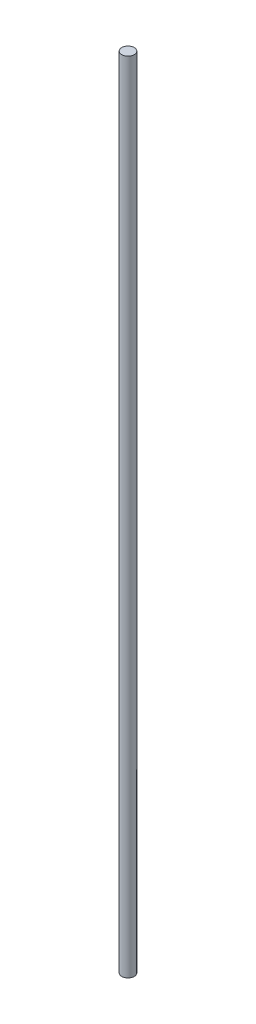
ISO-10303-21;
HEADER;
FILE_DESCRIPTION(('STEP AP214'),'2;1');
FILE_NAME('part.step','',(''),(''),'','','');
FILE_SCHEMA(('AUTOMOTIVE_DESIGN { 1 0 10303 214 1 1 1 1 }'));
ENDSEC;
DATA;
#1=APPLICATION_CONTEXT('core data for automotive mechanical design processes');
#2=APPLICATION_PROTOCOL_DEFINITION('international standard','automotive_design',2000,#1);
#3=PRODUCT_CONTEXT('',#1,'mechanical');
#4=PRODUCT('Part','Part','',(#3));
#5=PRODUCT_RELATED_PRODUCT_CATEGORY('part','',(#4));
#6=PRODUCT_DEFINITION_FORMATION('','',#4);
#7=PRODUCT_DEFINITION_CONTEXT('part definition',#1,'design');
#8=PRODUCT_DEFINITION('design','',#6,#7);
#9=PRODUCT_DEFINITION_SHAPE('','',#8);
#10=(LENGTH_UNIT() NAMED_UNIT(*) SI_UNIT(.MILLI.,.METRE.));
#11=(NAMED_UNIT(*) PLANE_ANGLE_UNIT() SI_UNIT($,.RADIAN.));
#12=(NAMED_UNIT(*) SI_UNIT($,.STERADIAN.) SOLID_ANGLE_UNIT());
#13=UNCERTAINTY_MEASURE_WITH_UNIT(LENGTH_MEASURE(1.E-05),#10,'distance_accuracy_value','');
#14=(GEOMETRIC_REPRESENTATION_CONTEXT(3) GLOBAL_UNCERTAINTY_ASSIGNED_CONTEXT((#13)) GLOBAL_UNIT_ASSIGNED_CONTEXT((#10,
#11,#12)) REPRESENTATION_CONTEXT('',''));
#15=CARTESIAN_POINT('',(0.,0.,0.));
#16=DIRECTION('',(0.,0.,1.));
#17=DIRECTION('',(1.,0.,0.));
#18=AXIS2_PLACEMENT_3D('',#15,#16,#17);
#19=CARTESIAN_POINT('',(0.,640.,0.));
#20=DIRECTION('',(0.,-1.,0.));
#21=DIRECTION('',(0.,0.,-1.));
#22=AXIS2_PLACEMENT_3D('',#19,#20,#21);
#23=CYLINDRICAL_SURFACE('',#22,5.);
#24=CARTESIAN_POINT('',(0.,640.,0.));
#25=DIRECTION('',(0.,1.,0.));
#26=DIRECTION('',(0.,0.,1.));
#27=AXIS2_PLACEMENT_3D('',#24,#25,#26);
#28=CIRCLE('',#27,5.);
#29=CARTESIAN_POINT('',(0.,640.,5.));
#30=VERTEX_POINT('',#29);
#31=EDGE_CURVE('E10',#30,#30,#28,.T.);
#32=ORIENTED_EDGE('',*,*,#31,.F.);
#33=EDGE_LOOP('',(#32));
#34=FACE_BOUND('',#33,.T.);
#35=CARTESIAN_POINT('',(0.,0.,0.));
#36=DIRECTION('',(0.,1.,0.));
#37=DIRECTION('',(0.,0.,1.));
#38=AXIS2_PLACEMENT_3D('',#35,#36,#37);
#39=CIRCLE('',#38,5.);
#40=CARTESIAN_POINT('',(0.,0.,5.));
#41=VERTEX_POINT('',#40);
#42=EDGE_CURVE('E42',#41,#41,#39,.T.);
#43=ORIENTED_EDGE('',*,*,#42,.T.);
#44=EDGE_LOOP('',(#43));
#45=FACE_BOUND('',#44,.T.);
#46=ADVANCED_FACE('F39',(#34,#45),#23,.T.);
#47=CARTESIAN_POINT('',(0.,640.,0.));
#48=DIRECTION('',(0.,1.,0.));
#49=DIRECTION('',(0.,0.,1.));
#50=AXIS2_PLACEMENT_3D('',#47,#48,#49);
#51=PLANE('',#50);
#52=ORIENTED_EDGE('',*,*,#31,.T.);
#53=EDGE_LOOP('',(#52));
#54=FACE_BOUND('',#53,.T.);
#55=ADVANCED_FACE('F56',(#54),#51,.T.);
#56=CARTESIAN_POINT('',(0.,0.,0.));
#57=DIRECTION('',(0.,1.,0.));
#58=DIRECTION('',(0.,0.,1.));
#59=AXIS2_PLACEMENT_3D('',#56,#57,#58);
#60=PLANE('',#59);
#61=ORIENTED_EDGE('',*,*,#42,.F.);
#62=EDGE_LOOP('',(#61));
#63=FACE_BOUND('',#62,.T.);
#64=ADVANCED_FACE('F54',(#63),#60,.F.);
#65=CLOSED_SHELL('',(#46,#55,#64));
#66=MANIFOLD_SOLID_BREP('B2',#65);
#67=ADVANCED_BREP_SHAPE_REPRESENTATION('',(#18,#66),#14);
#68=SHAPE_DEFINITION_REPRESENTATION(#9,#67);
ENDSEC;
END-ISO-10303-21;
